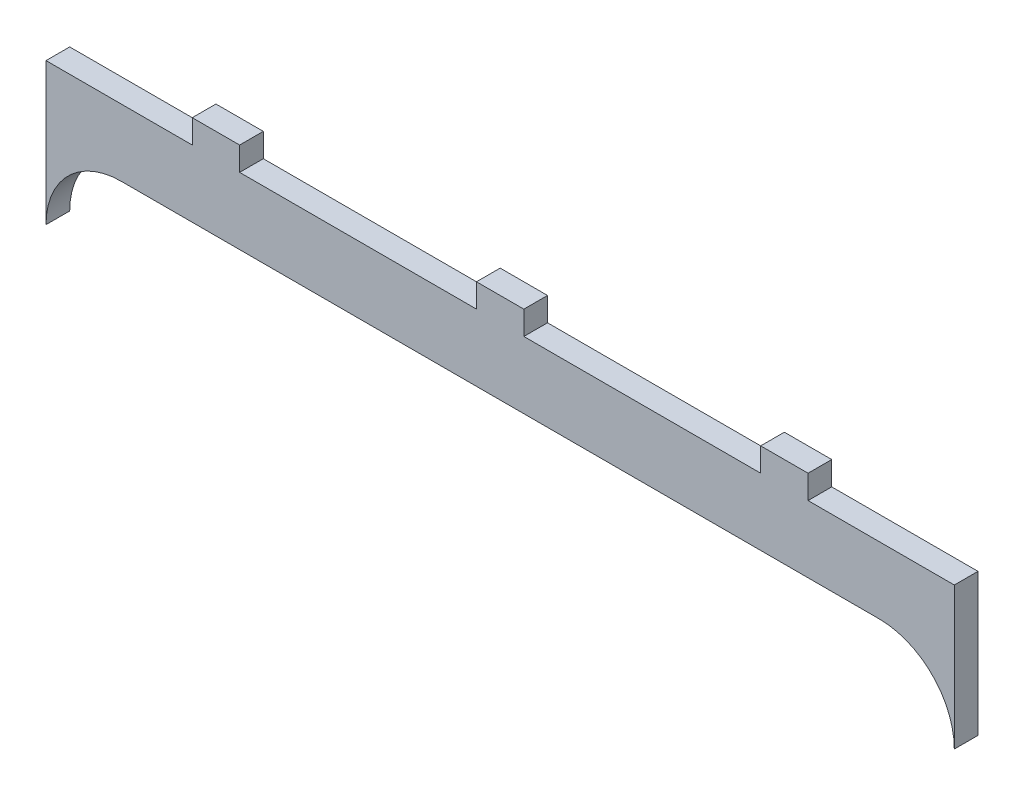
ISO-10303-21;
HEADER;
FILE_DESCRIPTION(('STEP AP214'),'2;1');
FILE_NAME('part.step','',(''),(''),'','','');
FILE_SCHEMA(('AUTOMOTIVE_DESIGN { 1 0 10303 214 1 1 1 1 }'));
ENDSEC;
DATA;
#1=APPLICATION_CONTEXT('core data for automotive mechanical design processes');
#2=APPLICATION_PROTOCOL_DEFINITION('international standard','automotive_design',2000,#1);
#3=PRODUCT_CONTEXT('',#1,'mechanical');
#4=PRODUCT('Part','Part','',(#3));
#5=PRODUCT_RELATED_PRODUCT_CATEGORY('part','',(#4));
#6=PRODUCT_DEFINITION_FORMATION('','',#4);
#7=PRODUCT_DEFINITION_CONTEXT('part definition',#1,'design');
#8=PRODUCT_DEFINITION('design','',#6,#7);
#9=PRODUCT_DEFINITION_SHAPE('','',#8);
#10=(LENGTH_UNIT() NAMED_UNIT(*) SI_UNIT(.MILLI.,.METRE.));
#11=(NAMED_UNIT(*) PLANE_ANGLE_UNIT() SI_UNIT($,.RADIAN.));
#12=(NAMED_UNIT(*) SI_UNIT($,.STERADIAN.) SOLID_ANGLE_UNIT());
#13=UNCERTAINTY_MEASURE_WITH_UNIT(LENGTH_MEASURE(1.E-05),#10,'distance_accuracy_value','');
#14=(GEOMETRIC_REPRESENTATION_CONTEXT(3) GLOBAL_UNCERTAINTY_ASSIGNED_CONTEXT((#13)) GLOBAL_UNIT_ASSIGNED_CONTEXT((#10,
#11,#12)) REPRESENTATION_CONTEXT('',''));
#15=CARTESIAN_POINT('',(0.,0.,0.));
#16=DIRECTION('',(0.,0.,1.));
#17=DIRECTION('',(1.,0.,0.));
#18=AXIS2_PLACEMENT_3D('',#15,#16,#17);
#19=CARTESIAN_POINT('',(80.,0.,2.5));
#20=DIRECTION('',(0.,0.,-1.));
#21=DIRECTION('',(-1.,0.,0.));
#22=AXIS2_PLACEMENT_3D('',#19,#20,#21);
#23=CYLINDRICAL_SURFACE('',#22,15.875);
#24=CARTESIAN_POINT('',(80.,0.,-2.5));
#25=DIRECTION('',(0.,0.,1.));
#26=DIRECTION('',(1.,0.,0.));
#27=AXIS2_PLACEMENT_3D('',#24,#25,#26);
#28=CIRCLE('',#27,15.875);
#29=CARTESIAN_POINT('',(95.875,0.,-2.5));
#30=VERTEX_POINT('',#29);
#31=CARTESIAN_POINT('',(80.,15.875,-2.5));
#32=VERTEX_POINT('',#31);
#33=EDGE_CURVE('E193',#30,#32,#28,.T.);
#34=ORIENTED_EDGE('',*,*,#33,.F.);
#35=DIRECTION('',(0.,0.,-1.));
#36=VECTOR('',#35,1.);
#37=CARTESIAN_POINT('',(95.875,0.,2.5));
#38=LINE('',#37,#36);
#39=CARTESIAN_POINT('',(95.875,0.,2.5));
#40=VERTEX_POINT('',#39);
#41=EDGE_CURVE('E11',#40,#30,#38,.T.);
#42=ORIENTED_EDGE('',*,*,#41,.F.);
#43=CARTESIAN_POINT('',(80.,0.,2.5));
#44=DIRECTION('',(0.,0.,1.));
#45=DIRECTION('',(1.,0.,0.));
#46=AXIS2_PLACEMENT_3D('',#43,#44,#45);
#47=CIRCLE('',#46,15.875);
#48=CARTESIAN_POINT('',(80.,15.875,2.5));
#49=VERTEX_POINT('',#48);
#50=EDGE_CURVE('E236',#40,#49,#47,.T.);
#51=ORIENTED_EDGE('',*,*,#50,.T.);
#52=DIRECTION('',(0.,0.,-1.));
#53=VECTOR('',#52,1.);
#54=CARTESIAN_POINT('',(80.,15.875,2.5));
#55=LINE('',#54,#53);
#56=EDGE_CURVE('E121',#49,#32,#55,.T.);
#57=ORIENTED_EDGE('',*,*,#56,.T.);
#58=EDGE_LOOP('',(#34,#42,#51,#57));
#59=FACE_BOUND('',#58,.T.);
#60=ADVANCED_FACE('F41',(#59),#23,.F.);
#61=CARTESIAN_POINT('',(95.875,0.,2.5));
#62=DIRECTION('',(1.,0.,0.));
#63=DIRECTION('',(0.,0.,-1.));
#64=AXIS2_PLACEMENT_3D('',#61,#62,#63);
#65=PLANE('',#64);
#66=DIRECTION('',(0.,-1.,0.));
#67=VECTOR('',#66,1.);
#68=CARTESIAN_POINT('',(95.875,0.,-2.5));
#69=LINE('',#68,#67);
#70=CARTESIAN_POINT('',(95.875,30.,-2.5));
#71=VERTEX_POINT('',#70);
#72=EDGE_CURVE('E196',#71,#30,#69,.T.);
#73=ORIENTED_EDGE('',*,*,#72,.F.);
#74=DIRECTION('',(0.,0.,-1.));
#75=VECTOR('',#74,1.);
#76=CARTESIAN_POINT('',(95.875,30.,2.5));
#77=LINE('',#76,#75);
#78=CARTESIAN_POINT('',(95.875,30.,2.5));
#79=VERTEX_POINT('',#78);
#80=EDGE_CURVE('E49',#79,#71,#77,.T.);
#81=ORIENTED_EDGE('',*,*,#80,.F.);
#82=DIRECTION('',(0.,-1.,0.));
#83=VECTOR('',#82,1.);
#84=CARTESIAN_POINT('',(95.875,0.,2.5));
#85=LINE('',#84,#83);
#86=EDGE_CURVE('E287',#79,#40,#85,.T.);
#87=ORIENTED_EDGE('',*,*,#86,.T.);
#88=ORIENTED_EDGE('',*,*,#41,.T.);
#89=EDGE_LOOP('',(#73,#81,#87,#88));
#90=FACE_BOUND('',#89,.T.);
#91=ADVANCED_FACE('F274',(#90),#65,.T.);
#92=CARTESIAN_POINT('',(0.,30.,2.5));
#93=DIRECTION('',(0.,1.,0.));
#94=DIRECTION('',(-1.,0.,0.));
#95=AXIS2_PLACEMENT_3D('',#92,#93,#94);
#96=PLANE('',#95);
#97=DIRECTION('',(1.,0.,0.));
#98=VECTOR('',#97,1.);
#99=CARTESIAN_POINT('',(0.,30.,-2.5));
#100=LINE('',#99,#98);
#101=CARTESIAN_POINT('',(65.,30.,-2.5));
#102=VERTEX_POINT('',#101);
#103=EDGE_CURVE('E199',#102,#71,#100,.T.);
#104=ORIENTED_EDGE('',*,*,#103,.F.);
#105=DIRECTION('',(0.,0.,-1.));
#106=VECTOR('',#105,1.);
#107=CARTESIAN_POINT('',(65.,30.,2.5));
#108=LINE('',#107,#106);
#109=CARTESIAN_POINT('',(65.,30.,2.5));
#110=VERTEX_POINT('',#109);
#111=EDGE_CURVE('E263',#110,#102,#108,.T.);
#112=ORIENTED_EDGE('',*,*,#111,.F.);
#113=DIRECTION('',(1.,0.,0.));
#114=VECTOR('',#113,1.);
#115=CARTESIAN_POINT('',(0.,30.,2.5));
#116=LINE('',#115,#114);
#117=EDGE_CURVE('E270',#110,#79,#116,.T.);
#118=ORIENTED_EDGE('',*,*,#117,.T.);
#119=ORIENTED_EDGE('',*,*,#80,.T.);
#120=EDGE_LOOP('',(#104,#112,#118,#119));
#121=FACE_BOUND('',#120,.T.);
#122=ADVANCED_FACE('F268',(#121),#96,.T.);
#123=CARTESIAN_POINT('',(65.,0.,2.5));
#124=DIRECTION('',(1.,0.,0.));
#125=DIRECTION('',(0.,0.,-1.));
#126=AXIS2_PLACEMENT_3D('',#123,#124,#125);
#127=PLANE('',#126);
#128=DIRECTION('',(0.,-1.,0.));
#129=VECTOR('',#128,1.);
#130=CARTESIAN_POINT('',(65.,0.,-2.5));
#131=LINE('',#130,#129);
#132=CARTESIAN_POINT('',(65.,35.,-2.5));
#133=VERTEX_POINT('',#132);
#134=EDGE_CURVE('E202',#133,#102,#131,.T.);
#135=ORIENTED_EDGE('',*,*,#134,.F.);
#136=DIRECTION('',(0.,0.,-1.));
#137=VECTOR('',#136,1.);
#138=CARTESIAN_POINT('',(65.,35.,2.5));
#139=LINE('',#138,#137);
#140=CARTESIAN_POINT('',(65.,35.,2.5));
#141=VERTEX_POINT('',#140);
#142=EDGE_CURVE('E261',#141,#133,#139,.T.);
#143=ORIENTED_EDGE('',*,*,#142,.F.);
#144=DIRECTION('',(0.,-1.,0.));
#145=VECTOR('',#144,1.);
#146=CARTESIAN_POINT('',(65.,0.,2.5));
#147=LINE('',#146,#145);
#148=EDGE_CURVE('E284',#141,#110,#147,.T.);
#149=ORIENTED_EDGE('',*,*,#148,.T.);
#150=ORIENTED_EDGE('',*,*,#111,.T.);
#151=EDGE_LOOP('',(#135,#143,#149,#150));
#152=FACE_BOUND('',#151,.T.);
#153=ADVANCED_FACE('F281',(#152),#127,.T.);
#154=CARTESIAN_POINT('',(0.,35.,2.5));
#155=DIRECTION('',(0.,1.,0.));
#156=DIRECTION('',(0.,0.,1.));
#157=AXIS2_PLACEMENT_3D('',#154,#155,#156);
#158=PLANE('',#157);
#159=DIRECTION('',(1.,0.,0.));
#160=VECTOR('',#159,1.);
#161=CARTESIAN_POINT('',(0.,35.,-2.5));
#162=LINE('',#161,#160);
#163=CARTESIAN_POINT('',(55.,35.,-2.5));
#164=VERTEX_POINT('',#163);
#165=EDGE_CURVE('E207',#164,#133,#162,.T.);
#166=ORIENTED_EDGE('',*,*,#165,.F.);
#167=DIRECTION('',(0.,0.,-1.));
#168=VECTOR('',#167,1.);
#169=CARTESIAN_POINT('',(55.,35.,2.5));
#170=LINE('',#169,#168);
#171=CARTESIAN_POINT('',(55.,35.,2.5));
#172=VERTEX_POINT('',#171);
#173=EDGE_CURVE('E259',#172,#164,#170,.T.);
#174=ORIENTED_EDGE('',*,*,#173,.F.);
#175=DIRECTION('',(1.,0.,0.));
#176=VECTOR('',#175,1.);
#177=CARTESIAN_POINT('',(0.,35.,2.5));
#178=LINE('',#177,#176);
#179=EDGE_CURVE('E290',#172,#141,#178,.T.);
#180=ORIENTED_EDGE('',*,*,#179,.T.);
#181=ORIENTED_EDGE('',*,*,#142,.T.);
#182=EDGE_LOOP('',(#166,#174,#180,#181));
#183=FACE_BOUND('',#182,.T.);
#184=ADVANCED_FACE('F345',(#183),#158,.T.);
#185=CARTESIAN_POINT('',(55.,0.,2.5));
#186=DIRECTION('',(1.,0.,0.));
#187=DIRECTION('',(0.,0.,-1.));
#188=AXIS2_PLACEMENT_3D('',#185,#186,#187);
#189=PLANE('',#188);
#190=DIRECTION('',(0.,-1.,0.));
#191=VECTOR('',#190,1.);
#192=CARTESIAN_POINT('',(55.,0.,-2.5));
#193=LINE('',#192,#191);
#194=CARTESIAN_POINT('',(55.,30.,-2.5));
#195=VERTEX_POINT('',#194);
#196=EDGE_CURVE('E210',#164,#195,#193,.T.);
#197=ORIENTED_EDGE('',*,*,#196,.T.);
#198=DIRECTION('',(0.,0.,-1.));
#199=VECTOR('',#198,1.);
#200=CARTESIAN_POINT('',(55.,30.,2.5));
#201=LINE('',#200,#199);
#202=CARTESIAN_POINT('',(55.,30.,2.5));
#203=VERTEX_POINT('',#202);
#204=EDGE_CURVE('E257',#203,#195,#201,.T.);
#205=ORIENTED_EDGE('',*,*,#204,.F.);
#206=DIRECTION('',(0.,-1.,0.));
#207=VECTOR('',#206,1.);
#208=CARTESIAN_POINT('',(55.,0.,2.5));
#209=LINE('',#208,#207);
#210=EDGE_CURVE('E297',#172,#203,#209,.T.);
#211=ORIENTED_EDGE('',*,*,#210,.F.);
#212=ORIENTED_EDGE('',*,*,#173,.T.);
#213=EDGE_LOOP('',(#197,#205,#211,#212));
#214=FACE_BOUND('',#213,.T.);
#215=ADVANCED_FACE('F348',(#214),#189,.F.);
#216=CARTESIAN_POINT('',(5.,30.,-2.5));
#217=VERTEX_POINT('',#216);
#218=EDGE_CURVE('E204',#217,#195,#100,.T.);
#219=ORIENTED_EDGE('',*,*,#218,.F.);
#220=DIRECTION('',(0.,0.,-1.));
#221=VECTOR('',#220,1.);
#222=CARTESIAN_POINT('',(5.,30.,2.5));
#223=LINE('',#222,#221);
#224=CARTESIAN_POINT('',(5.,30.,2.5));
#225=VERTEX_POINT('',#224);
#226=EDGE_CURVE('E255',#225,#217,#223,.T.);
#227=ORIENTED_EDGE('',*,*,#226,.F.);
#228=EDGE_CURVE('E289',#225,#203,#116,.T.);
#229=ORIENTED_EDGE('',*,*,#228,.T.);
#230=ORIENTED_EDGE('',*,*,#204,.T.);
#231=EDGE_LOOP('',(#219,#227,#229,#230));
#232=FACE_BOUND('',#231,.T.);
#233=ADVANCED_FACE('F341',(#232),#96,.T.);
#234=CARTESIAN_POINT('',(5.00000000000001,0.,2.5));
#235=DIRECTION('',(1.,0.,0.));
#236=DIRECTION('',(0.,1.,0.));
#237=AXIS2_PLACEMENT_3D('',#234,#235,#236);
#238=PLANE('',#237);
#239=DIRECTION('',(0.,-1.,0.));
#240=VECTOR('',#239,1.);
#241=CARTESIAN_POINT('',(5.00000000000001,0.,-2.5));
#242=LINE('',#241,#240);
#243=CARTESIAN_POINT('',(5.,35.,-2.5));
#244=VERTEX_POINT('',#243);
#245=EDGE_CURVE('E213',#244,#217,#242,.T.);
#246=ORIENTED_EDGE('',*,*,#245,.F.);
#247=DIRECTION('',(0.,0.,-1.));
#248=VECTOR('',#247,1.);
#249=CARTESIAN_POINT('',(5.,35.,2.5));
#250=LINE('',#249,#248);
#251=CARTESIAN_POINT('',(5.,35.,2.5));
#252=VERTEX_POINT('',#251);
#253=EDGE_CURVE('E253',#252,#244,#250,.T.);
#254=ORIENTED_EDGE('',*,*,#253,.F.);
#255=DIRECTION('',(0.,-1.,0.));
#256=VECTOR('',#255,1.);
#257=CARTESIAN_POINT('',(5.00000000000001,0.,2.5));
#258=LINE('',#257,#256);
#259=EDGE_CURVE('E296',#252,#225,#258,.T.);
#260=ORIENTED_EDGE('',*,*,#259,.T.);
#261=ORIENTED_EDGE('',*,*,#226,.T.);
#262=EDGE_LOOP('',(#246,#254,#260,#261));
#263=FACE_BOUND('',#262,.T.);
#264=ADVANCED_FACE('F353',(#263),#238,.T.);
#265=CARTESIAN_POINT('',(0.,35.,2.5));
#266=DIRECTION('',(0.,1.,0.));
#267=DIRECTION('',(0.,0.,1.));
#268=AXIS2_PLACEMENT_3D('',#265,#266,#267);
#269=PLANE('',#268);
#270=DIRECTION('',(1.,0.,0.));
#271=VECTOR('',#270,1.);
#272=CARTESIAN_POINT('',(0.,35.,-2.5));
#273=LINE('',#272,#271);
#274=CARTESIAN_POINT('',(-5.,35.,-2.5));
#275=VERTEX_POINT('',#274);
#276=EDGE_CURVE('E216',#275,#244,#273,.T.);
#277=ORIENTED_EDGE('',*,*,#276,.F.);
#278=DIRECTION('',(0.,0.,-1.));
#279=VECTOR('',#278,1.);
#280=CARTESIAN_POINT('',(-5.,35.,2.5));
#281=LINE('',#280,#279);
#282=CARTESIAN_POINT('',(-5.,35.,2.5));
#283=VERTEX_POINT('',#282);
#284=EDGE_CURVE('E251',#283,#275,#281,.T.);
#285=ORIENTED_EDGE('',*,*,#284,.F.);
#286=DIRECTION('',(1.,0.,0.));
#287=VECTOR('',#286,1.);
#288=CARTESIAN_POINT('',(0.,35.,2.5));
#289=LINE('',#288,#287);
#290=EDGE_CURVE('E301',#283,#252,#289,.T.);
#291=ORIENTED_EDGE('',*,*,#290,.T.);
#292=ORIENTED_EDGE('',*,*,#253,.T.);
#293=EDGE_LOOP('',(#277,#285,#291,#292));
#294=FACE_BOUND('',#293,.T.);
#295=ADVANCED_FACE('F356',(#294),#269,.T.);
#296=CARTESIAN_POINT('',(-5.,0.,2.5));
#297=DIRECTION('',(1.,0.,0.));
#298=DIRECTION('',(0.,0.,-1.));
#299=AXIS2_PLACEMENT_3D('',#296,#297,#298);
#300=PLANE('',#299);
#301=DIRECTION('',(0.,-1.,0.));
#302=VECTOR('',#301,1.);
#303=CARTESIAN_POINT('',(-5.,0.,-2.5));
#304=LINE('',#303,#302);
#305=CARTESIAN_POINT('',(-5.,30.,-2.5));
#306=VERTEX_POINT('',#305);
#307=EDGE_CURVE('E219',#275,#306,#304,.T.);
#308=ORIENTED_EDGE('',*,*,#307,.T.);
#309=DIRECTION('',(0.,0.,-1.));
#310=VECTOR('',#309,1.);
#311=CARTESIAN_POINT('',(-5.,30.,2.5));
#312=LINE('',#311,#310);
#313=CARTESIAN_POINT('',(-5.,30.,2.5));
#314=VERTEX_POINT('',#313);
#315=EDGE_CURVE('E249',#314,#306,#312,.T.);
#316=ORIENTED_EDGE('',*,*,#315,.F.);
#317=DIRECTION('',(0.,-1.,0.));
#318=VECTOR('',#317,1.);
#319=CARTESIAN_POINT('',(-5.,0.,2.5));
#320=LINE('',#319,#318);
#321=EDGE_CURVE('E306',#283,#314,#320,.T.);
#322=ORIENTED_EDGE('',*,*,#321,.F.);
#323=ORIENTED_EDGE('',*,*,#284,.T.);
#324=EDGE_LOOP('',(#308,#316,#322,#323));
#325=FACE_BOUND('',#324,.T.);
#326=ADVANCED_FACE('F360',(#325),#300,.F.);
#327=CARTESIAN_POINT('',(-55.,30.,-2.5));
#328=VERTEX_POINT('',#327);
#329=EDGE_CURVE('E222',#328,#306,#100,.T.);
#330=ORIENTED_EDGE('',*,*,#329,.F.);
#331=DIRECTION('',(0.,0.,-1.));
#332=VECTOR('',#331,1.);
#333=CARTESIAN_POINT('',(-55.,30.,2.5));
#334=LINE('',#333,#332);
#335=CARTESIAN_POINT('',(-55.,30.,2.5));
#336=VERTEX_POINT('',#335);
#337=EDGE_CURVE('E247',#336,#328,#334,.T.);
#338=ORIENTED_EDGE('',*,*,#337,.F.);
#339=EDGE_CURVE('E294',#336,#314,#116,.T.);
#340=ORIENTED_EDGE('',*,*,#339,.T.);
#341=ORIENTED_EDGE('',*,*,#315,.T.);
#342=EDGE_LOOP('',(#330,#338,#340,#341));
#343=FACE_BOUND('',#342,.T.);
#344=ADVANCED_FACE('F364',(#343),#96,.T.);
#345=CARTESIAN_POINT('',(-55.,0.,2.5));
#346=DIRECTION('',(1.,0.,0.));
#347=DIRECTION('',(0.,0.,-1.));
#348=AXIS2_PLACEMENT_3D('',#345,#346,#347);
#349=PLANE('',#348);
#350=DIRECTION('',(0.,-1.,0.));
#351=VECTOR('',#350,1.);
#352=CARTESIAN_POINT('',(-55.,0.,-2.5));
#353=LINE('',#352,#351);
#354=CARTESIAN_POINT('',(-55.,35.,-2.5));
#355=VERTEX_POINT('',#354);
#356=EDGE_CURVE('E223',#355,#328,#353,.T.);
#357=ORIENTED_EDGE('',*,*,#356,.F.);
#358=DIRECTION('',(0.,0.,-1.));
#359=VECTOR('',#358,1.);
#360=CARTESIAN_POINT('',(-55.,35.,2.5));
#361=LINE('',#360,#359);
#362=CARTESIAN_POINT('',(-55.,35.,2.5));
#363=VERTEX_POINT('',#362);
#364=EDGE_CURVE('E245',#363,#355,#361,.T.);
#365=ORIENTED_EDGE('',*,*,#364,.F.);
#366=DIRECTION('',(0.,-1.,0.));
#367=VECTOR('',#366,1.);
#368=CARTESIAN_POINT('',(-55.,0.,2.5));
#369=LINE('',#368,#367);
#370=EDGE_CURVE('E305',#363,#336,#369,.T.);
#371=ORIENTED_EDGE('',*,*,#370,.T.);
#372=ORIENTED_EDGE('',*,*,#337,.T.);
#373=EDGE_LOOP('',(#357,#365,#371,#372));
#374=FACE_BOUND('',#373,.T.);
#375=ADVANCED_FACE('F366',(#374),#349,.T.);
#376=CARTESIAN_POINT('',(0.,35.,2.5));
#377=DIRECTION('',(0.,-1.,0.));
#378=DIRECTION('',(0.,0.,-1.));
#379=AXIS2_PLACEMENT_3D('',#376,#377,#378);
#380=PLANE('',#379);
#381=DIRECTION('',(-1.,0.,0.));
#382=VECTOR('',#381,1.);
#383=CARTESIAN_POINT('',(0.,35.,-2.5));
#384=LINE('',#383,#382);
#385=CARTESIAN_POINT('',(-65.,35.,-2.5));
#386=VERTEX_POINT('',#385);
#387=EDGE_CURVE('E226',#355,#386,#384,.T.);
#388=ORIENTED_EDGE('',*,*,#387,.T.);
#389=DIRECTION('',(0.,0.,-1.));
#390=VECTOR('',#389,1.);
#391=CARTESIAN_POINT('',(-65.,35.,2.5));
#392=LINE('',#391,#390);
#393=CARTESIAN_POINT('',(-65.,35.,2.5));
#394=VERTEX_POINT('',#393);
#395=EDGE_CURVE('E242',#394,#386,#392,.T.);
#396=ORIENTED_EDGE('',*,*,#395,.F.);
#397=DIRECTION('',(-1.,0.,0.));
#398=VECTOR('',#397,1.);
#399=CARTESIAN_POINT('',(0.,35.,2.5));
#400=LINE('',#399,#398);
#401=EDGE_CURVE('E310',#363,#394,#400,.T.);
#402=ORIENTED_EDGE('',*,*,#401,.F.);
#403=ORIENTED_EDGE('',*,*,#364,.T.);
#404=EDGE_LOOP('',(#388,#396,#402,#403));
#405=FACE_BOUND('',#404,.T.);
#406=ADVANCED_FACE('F369',(#405),#380,.F.);
#407=CARTESIAN_POINT('',(-65.,0.,2.5));
#408=DIRECTION('',(1.,0.,0.));
#409=DIRECTION('',(0.,0.,-1.));
#410=AXIS2_PLACEMENT_3D('',#407,#408,#409);
#411=PLANE('',#410);
#412=DIRECTION('',(0.,-1.,0.));
#413=VECTOR('',#412,1.);
#414=CARTESIAN_POINT('',(-65.,0.,-2.5));
#415=LINE('',#414,#413);
#416=CARTESIAN_POINT('',(-65.,30.,-2.5));
#417=VERTEX_POINT('',#416);
#418=EDGE_CURVE('E228',#386,#417,#415,.T.);
#419=ORIENTED_EDGE('',*,*,#418,.T.);
#420=DIRECTION('',(0.,0.,-1.));
#421=VECTOR('',#420,1.);
#422=CARTESIAN_POINT('',(-65.,30.,2.5));
#423=LINE('',#422,#421);
#424=CARTESIAN_POINT('',(-65.,30.,2.5));
#425=VERTEX_POINT('',#424);
#426=EDGE_CURVE('E240',#425,#417,#423,.T.);
#427=ORIENTED_EDGE('',*,*,#426,.F.);
#428=DIRECTION('',(0.,-1.,0.));
#429=VECTOR('',#428,1.);
#430=CARTESIAN_POINT('',(-65.,0.,2.5));
#431=LINE('',#430,#429);
#432=EDGE_CURVE('E293',#394,#425,#431,.T.);
#433=ORIENTED_EDGE('',*,*,#432,.F.);
#434=ORIENTED_EDGE('',*,*,#395,.T.);
#435=EDGE_LOOP('',(#419,#427,#433,#434));
#436=FACE_BOUND('',#435,.T.);
#437=ADVANCED_FACE('F325',(#436),#411,.F.);
#438=CARTESIAN_POINT('',(-95.875,30.,-2.5));
#439=VERTEX_POINT('',#438);
#440=EDGE_CURVE('E203',#439,#417,#100,.T.);
#441=ORIENTED_EDGE('',*,*,#440,.F.);
#442=DIRECTION('',(0.,0.,-1.));
#443=VECTOR('',#442,1.);
#444=CARTESIAN_POINT('',(-95.875,30.,2.5));
#445=LINE('',#444,#443);
#446=CARTESIAN_POINT('',(-95.875,30.,2.5));
#447=VERTEX_POINT('',#446);
#448=EDGE_CURVE('E180',#447,#439,#445,.T.);
#449=ORIENTED_EDGE('',*,*,#448,.F.);
#450=EDGE_CURVE('E186',#447,#425,#116,.T.);
#451=ORIENTED_EDGE('',*,*,#450,.T.);
#452=ORIENTED_EDGE('',*,*,#426,.T.);
#453=EDGE_LOOP('',(#441,#449,#451,#452));
#454=FACE_BOUND('',#453,.T.);
#455=ADVANCED_FACE('F330',(#454),#96,.T.);
#456=CARTESIAN_POINT('',(-95.875,0.,2.5));
#457=DIRECTION('',(-1.,0.,0.));
#458=DIRECTION('',(0.,0.,1.));
#459=AXIS2_PLACEMENT_3D('',#456,#457,#458);
#460=PLANE('',#459);
#461=DIRECTION('',(0.,1.,0.));
#462=VECTOR('',#461,1.);
#463=CARTESIAN_POINT('',(-95.875,0.,-2.5));
#464=LINE('',#463,#462);
#465=CARTESIAN_POINT('',(-95.875,0.,-2.5));
#466=VERTEX_POINT('',#465);
#467=EDGE_CURVE('E175',#466,#439,#464,.T.);
#468=ORIENTED_EDGE('',*,*,#467,.F.);
#469=DIRECTION('',(0.,0.,-1.));
#470=VECTOR('',#469,1.);
#471=CARTESIAN_POINT('',(-95.875,0.,2.5));
#472=LINE('',#471,#470);
#473=CARTESIAN_POINT('',(-95.875,0.,2.5));
#474=VERTEX_POINT('',#473);
#475=EDGE_CURVE('E170',#474,#466,#472,.T.);
#476=ORIENTED_EDGE('',*,*,#475,.F.);
#477=DIRECTION('',(0.,1.,0.));
#478=VECTOR('',#477,1.);
#479=CARTESIAN_POINT('',(-95.875,0.,2.5));
#480=LINE('',#479,#478);
#481=EDGE_CURVE('E173',#474,#447,#480,.T.);
#482=ORIENTED_EDGE('',*,*,#481,.T.);
#483=ORIENTED_EDGE('',*,*,#448,.T.);
#484=EDGE_LOOP('',(#468,#476,#482,#483));
#485=FACE_BOUND('',#484,.T.);
#486=ADVANCED_FACE('F172',(#485),#460,.T.);
#487=CARTESIAN_POINT('',(-80.,0.,2.5));
#488=DIRECTION('',(0.,0.,-1.));
#489=DIRECTION('',(-1.,0.,0.));
#490=AXIS2_PLACEMENT_3D('',#487,#488,#489);
#491=CYLINDRICAL_SURFACE('',#490,15.875);
#492=CARTESIAN_POINT('',(-80.,0.,-2.5));
#493=DIRECTION('',(0.,0.,1.));
#494=DIRECTION('',(1.,0.,0.));
#495=AXIS2_PLACEMENT_3D('',#492,#493,#494);
#496=CIRCLE('',#495,15.875);
#497=CARTESIAN_POINT('',(-80.,15.875,-2.5));
#498=VERTEX_POINT('',#497);
#499=EDGE_CURVE('E232',#498,#466,#496,.T.);
#500=ORIENTED_EDGE('',*,*,#499,.F.);
#501=DIRECTION('',(0.,0.,-1.));
#502=VECTOR('',#501,1.);
#503=CARTESIAN_POINT('',(-80.,15.875,2.5));
#504=LINE('',#503,#502);
#505=CARTESIAN_POINT('',(-80.,15.875,2.5));
#506=VERTEX_POINT('',#505);
#507=EDGE_CURVE('E114',#506,#498,#504,.T.);
#508=ORIENTED_EDGE('',*,*,#507,.F.);
#509=CARTESIAN_POINT('',(-80.,0.,2.5));
#510=DIRECTION('',(0.,0.,1.));
#511=DIRECTION('',(1.,0.,0.));
#512=AXIS2_PLACEMENT_3D('',#509,#510,#511);
#513=CIRCLE('',#512,15.875);
#514=EDGE_CURVE('E184',#506,#474,#513,.T.);
#515=ORIENTED_EDGE('',*,*,#514,.T.);
#516=ORIENTED_EDGE('',*,*,#475,.T.);
#517=EDGE_LOOP('',(#500,#508,#515,#516));
#518=FACE_BOUND('',#517,.T.);
#519=ADVANCED_FACE('F188',(#518),#491,.F.);
#520=CARTESIAN_POINT('',(0.,15.875,2.5));
#521=DIRECTION('',(0.,1.,0.));
#522=DIRECTION('',(0.,0.,1.));
#523=AXIS2_PLACEMENT_3D('',#520,#521,#522);
#524=PLANE('',#523);
#525=DIRECTION('',(1.,0.,0.));
#526=VECTOR('',#525,1.);
#527=CARTESIAN_POINT('',(0.,15.875,-2.5));
#528=LINE('',#527,#526);
#529=EDGE_CURVE('E234',#498,#32,#528,.T.);
#530=ORIENTED_EDGE('',*,*,#529,.T.);
#531=ORIENTED_EDGE('',*,*,#56,.F.);
#532=DIRECTION('',(1.,0.,0.));
#533=VECTOR('',#532,1.);
#534=CARTESIAN_POINT('',(0.,15.875,2.5));
#535=LINE('',#534,#533);
#536=EDGE_CURVE('E57',#506,#49,#535,.T.);
#537=ORIENTED_EDGE('',*,*,#536,.F.);
#538=ORIENTED_EDGE('',*,*,#507,.T.);
#539=EDGE_LOOP('',(#530,#531,#537,#538));
#540=FACE_BOUND('',#539,.T.);
#541=ADVANCED_FACE('F331',(#540),#524,.F.);
#542=CARTESIAN_POINT('',(0.,0.,2.5));
#543=DIRECTION('',(0.,0.,1.));
#544=DIRECTION('',(1.,0.,0.));
#545=AXIS2_PLACEMENT_3D('',#542,#543,#544);
#546=PLANE('',#545);
#547=ORIENTED_EDGE('',*,*,#50,.F.);
#548=ORIENTED_EDGE('',*,*,#86,.F.);
#549=ORIENTED_EDGE('',*,*,#117,.F.);
#550=ORIENTED_EDGE('',*,*,#148,.F.);
#551=ORIENTED_EDGE('',*,*,#179,.F.);
#552=ORIENTED_EDGE('',*,*,#210,.T.);
#553=ORIENTED_EDGE('',*,*,#228,.F.);
#554=ORIENTED_EDGE('',*,*,#259,.F.);
#555=ORIENTED_EDGE('',*,*,#290,.F.);
#556=ORIENTED_EDGE('',*,*,#321,.T.);
#557=ORIENTED_EDGE('',*,*,#339,.F.);
#558=ORIENTED_EDGE('',*,*,#370,.F.);
#559=ORIENTED_EDGE('',*,*,#401,.T.);
#560=ORIENTED_EDGE('',*,*,#432,.T.);
#561=ORIENTED_EDGE('',*,*,#450,.F.);
#562=ORIENTED_EDGE('',*,*,#481,.F.);
#563=ORIENTED_EDGE('',*,*,#514,.F.);
#564=ORIENTED_EDGE('',*,*,#536,.T.);
#565=EDGE_LOOP('',(#547,#548,#549,#550,#551,#552,#553,#554,#555,#556,#557,#558,#559,#560,#561,
#562,#563,#564));
#566=FACE_BOUND('',#565,.T.);
#567=ADVANCED_FACE('F183',(#566),#546,.T.);
#568=CARTESIAN_POINT('',(0.,0.,-2.5));
#569=DIRECTION('',(0.,0.,1.));
#570=DIRECTION('',(1.,0.,0.));
#571=AXIS2_PLACEMENT_3D('',#568,#569,#570);
#572=PLANE('',#571);
#573=ORIENTED_EDGE('',*,*,#33,.T.);
#574=ORIENTED_EDGE('',*,*,#529,.F.);
#575=ORIENTED_EDGE('',*,*,#499,.T.);
#576=ORIENTED_EDGE('',*,*,#467,.T.);
#577=ORIENTED_EDGE('',*,*,#440,.T.);
#578=ORIENTED_EDGE('',*,*,#418,.F.);
#579=ORIENTED_EDGE('',*,*,#387,.F.);
#580=ORIENTED_EDGE('',*,*,#356,.T.);
#581=ORIENTED_EDGE('',*,*,#329,.T.);
#582=ORIENTED_EDGE('',*,*,#307,.F.);
#583=ORIENTED_EDGE('',*,*,#276,.T.);
#584=ORIENTED_EDGE('',*,*,#245,.T.);
#585=ORIENTED_EDGE('',*,*,#218,.T.);
#586=ORIENTED_EDGE('',*,*,#196,.F.);
#587=ORIENTED_EDGE('',*,*,#165,.T.);
#588=ORIENTED_EDGE('',*,*,#134,.T.);
#589=ORIENTED_EDGE('',*,*,#103,.T.);
#590=ORIENTED_EDGE('',*,*,#72,.T.);
#591=EDGE_LOOP('',(#573,#574,#575,#576,#577,#578,#579,#580,#581,#582,#583,#584,#585,#586,#587,
#588,#589,#590));
#592=FACE_BOUND('',#591,.T.);
#593=ADVANCED_FACE('F276',(#592),#572,.F.);
#594=CLOSED_SHELL('',(#60,#91,#122,#153,#184,#215,#233,#264,#295,#326,#344,#375,#406,#437,#455,
#486,#519,#541,#567,#593));
#595=MANIFOLD_SOLID_BREP('B2',#594);
#596=ADVANCED_BREP_SHAPE_REPRESENTATION('',(#18,#595),#14);
#597=SHAPE_DEFINITION_REPRESENTATION(#9,#596);
ENDSEC;
END-ISO-10303-21;
